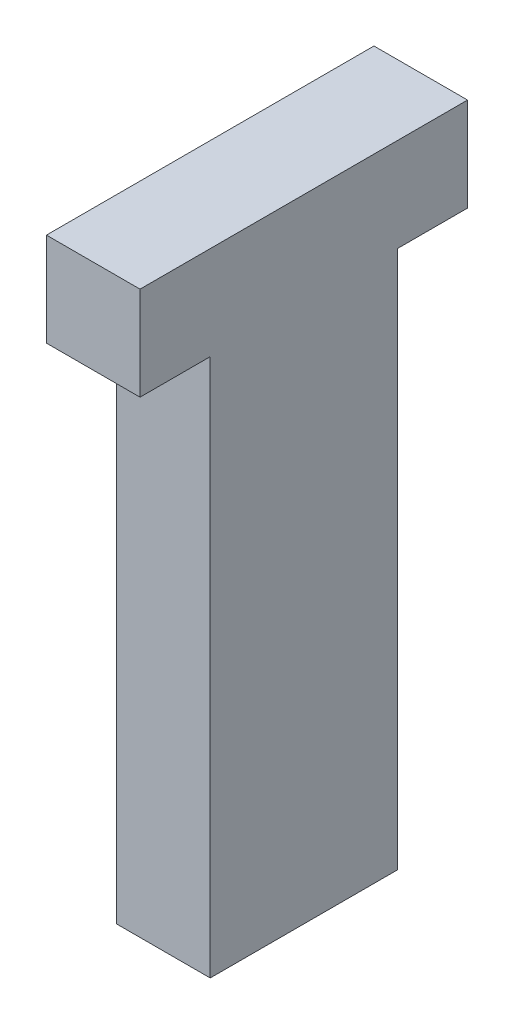
ISO-10303-21;
HEADER;
FILE_DESCRIPTION(('STEP AP214'),'2;1');
FILE_NAME('part.step','',(''),(''),'','','');
FILE_SCHEMA(('AUTOMOTIVE_DESIGN { 1 0 10303 214 1 1 1 1 }'));
ENDSEC;
DATA;
#1=APPLICATION_CONTEXT('core data for automotive mechanical design processes');
#2=APPLICATION_PROTOCOL_DEFINITION('international standard','automotive_design',2000,#1);
#3=PRODUCT_CONTEXT('',#1,'mechanical');
#4=PRODUCT('Part','Part','',(#3));
#5=PRODUCT_RELATED_PRODUCT_CATEGORY('part','',(#4));
#6=PRODUCT_DEFINITION_FORMATION('','',#4);
#7=PRODUCT_DEFINITION_CONTEXT('part definition',#1,'design');
#8=PRODUCT_DEFINITION('design','',#6,#7);
#9=PRODUCT_DEFINITION_SHAPE('','',#8);
#10=(LENGTH_UNIT() NAMED_UNIT(*) SI_UNIT(.MILLI.,.METRE.));
#11=(NAMED_UNIT(*) PLANE_ANGLE_UNIT() SI_UNIT($,.RADIAN.));
#12=(NAMED_UNIT(*) SI_UNIT($,.STERADIAN.) SOLID_ANGLE_UNIT());
#13=UNCERTAINTY_MEASURE_WITH_UNIT(LENGTH_MEASURE(1.E-05),#10,'distance_accuracy_value','');
#14=(GEOMETRIC_REPRESENTATION_CONTEXT(3) GLOBAL_UNCERTAINTY_ASSIGNED_CONTEXT((#13)) GLOBAL_UNIT_ASSIGNED_CONTEXT((#10,
#11,#12)) REPRESENTATION_CONTEXT('',''));
#15=CARTESIAN_POINT('',(0.,0.,0.));
#16=DIRECTION('',(0.,0.,1.));
#17=DIRECTION('',(1.,0.,0.));
#18=AXIS2_PLACEMENT_3D('',#15,#16,#17);
#19=CARTESIAN_POINT('',(0.,57.5,0.));
#20=DIRECTION('',(-1.,0.,0.));
#21=DIRECTION('',(0.,0.,1.));
#22=AXIS2_PLACEMENT_3D('',#19,#20,#21);
#23=PLANE('',#22);
#24=DIRECTION('',(0.,0.,-1.));
#25=VECTOR('',#24,1.);
#26=CARTESIAN_POINT('',(0.,0.,0.));
#27=LINE('',#26,#25);
#28=CARTESIAN_POINT('',(0.,0.,0.));
#29=VERTEX_POINT('',#28);
#30=CARTESIAN_POINT('',(0.,0.,-20.));
#31=VERTEX_POINT('',#30);
#32=EDGE_CURVE('E145',#29,#31,#27,.T.);
#33=ORIENTED_EDGE('',*,*,#32,.T.);
#34=DIRECTION('',(0.,-1.,0.));
#35=VECTOR('',#34,1.);
#36=CARTESIAN_POINT('',(0.,57.5,-20.));
#37=LINE('',#36,#35);
#38=CARTESIAN_POINT('',(0.,57.5,-20.));
#39=VERTEX_POINT('',#38);
#40=EDGE_CURVE('E11',#39,#31,#37,.T.);
#41=ORIENTED_EDGE('',*,*,#40,.F.);
#42=DIRECTION('',(0.,0.,-1.));
#43=VECTOR('',#42,1.);
#44=CARTESIAN_POINT('',(0.,57.5,-27.5));
#45=LINE('',#44,#43);
#46=CARTESIAN_POINT('',(0.,57.5,-27.5));
#47=VERTEX_POINT('',#46);
#48=EDGE_CURVE('E204',#39,#47,#45,.T.);
#49=ORIENTED_EDGE('',*,*,#48,.T.);
#50=DIRECTION('',(0.,-1.,0.));
#51=VECTOR('',#50,1.);
#52=CARTESIAN_POINT('',(0.,67.5,-27.5));
#53=LINE('',#52,#51);
#54=CARTESIAN_POINT('',(0.,67.5,-27.5));
#55=VERTEX_POINT('',#54);
#56=EDGE_CURVE('E152',#55,#47,#53,.T.);
#57=ORIENTED_EDGE('',*,*,#56,.F.);
#58=DIRECTION('',(0.,0.,-1.));
#59=VECTOR('',#58,1.);
#60=CARTESIAN_POINT('',(0.,67.5,0.));
#61=LINE('',#60,#59);
#62=CARTESIAN_POINT('',(0.,67.5,7.5));
#63=VERTEX_POINT('',#62);
#64=EDGE_CURVE('E128',#63,#55,#61,.T.);
#65=ORIENTED_EDGE('',*,*,#64,.F.);
#66=DIRECTION('',(0.,-1.,0.));
#67=VECTOR('',#66,1.);
#68=CARTESIAN_POINT('',(0.,67.5,7.5));
#69=LINE('',#68,#67);
#70=CARTESIAN_POINT('',(0.,57.5,7.5));
#71=VERTEX_POINT('',#70);
#72=EDGE_CURVE('E124',#63,#71,#69,.T.);
#73=ORIENTED_EDGE('',*,*,#72,.T.);
#74=CARTESIAN_POINT('',(0.,57.5,0.));
#75=VERTEX_POINT('',#74);
#76=EDGE_CURVE('E181',#71,#75,#45,.T.);
#77=ORIENTED_EDGE('',*,*,#76,.T.);
#78=DIRECTION('',(0.,-1.,0.));
#79=VECTOR('',#78,1.);
#80=CARTESIAN_POINT('',(0.,57.5,0.));
#81=LINE('',#80,#79);
#82=EDGE_CURVE('E161',#75,#29,#81,.T.);
#83=ORIENTED_EDGE('',*,*,#82,.T.);
#84=EDGE_LOOP('',(#33,#41,#49,#57,#65,#73,#77,#83));
#85=FACE_BOUND('',#84,.T.);
#86=ADVANCED_FACE('F45',(#85),#23,.F.);
#87=CARTESIAN_POINT('',(0.,57.5,-20.));
#88=DIRECTION('',(0.,0.,1.));
#89=DIRECTION('',(1.,0.,0.));
#90=AXIS2_PLACEMENT_3D('',#87,#88,#89);
#91=PLANE('',#90);
#92=DIRECTION('',(-1.,0.,0.));
#93=VECTOR('',#92,1.);
#94=CARTESIAN_POINT('',(0.,0.,-20.));
#95=LINE('',#94,#93);
#96=CARTESIAN_POINT('',(-10.,0.,-20.));
#97=VERTEX_POINT('',#96);
#98=EDGE_CURVE('E150',#31,#97,#95,.T.);
#99=ORIENTED_EDGE('',*,*,#98,.T.);
#100=DIRECTION('',(0.,-1.,0.));
#101=VECTOR('',#100,1.);
#102=CARTESIAN_POINT('',(-10.,57.5,-20.));
#103=LINE('',#102,#101);
#104=CARTESIAN_POINT('',(-10.,57.5,-20.));
#105=VERTEX_POINT('',#104);
#106=EDGE_CURVE('E54',#105,#97,#103,.T.);
#107=ORIENTED_EDGE('',*,*,#106,.F.);
#108=DIRECTION('',(-1.,0.,0.));
#109=VECTOR('',#108,1.);
#110=CARTESIAN_POINT('',(0.,57.5,-20.));
#111=LINE('',#110,#109);
#112=EDGE_CURVE('E88',#39,#105,#111,.T.);
#113=ORIENTED_EDGE('',*,*,#112,.F.);
#114=ORIENTED_EDGE('',*,*,#40,.T.);
#115=EDGE_LOOP('',(#99,#107,#113,#114));
#116=FACE_BOUND('',#115,.T.);
#117=ADVANCED_FACE('F226',(#116),#91,.F.);
#118=CARTESIAN_POINT('',(-10.,57.5,0.));
#119=DIRECTION('',(1.,0.,0.));
#120=DIRECTION('',(0.,0.,-1.));
#121=AXIS2_PLACEMENT_3D('',#118,#119,#120);
#122=PLANE('',#121);
#123=DIRECTION('',(0.,0.,1.));
#124=VECTOR('',#123,1.);
#125=CARTESIAN_POINT('',(-10.,0.,0.));
#126=LINE('',#125,#124);
#127=CARTESIAN_POINT('',(-10.,0.,0.));
#128=VERTEX_POINT('',#127);
#129=EDGE_CURVE('E78',#97,#128,#126,.T.);
#130=ORIENTED_EDGE('',*,*,#129,.T.);
#131=DIRECTION('',(0.,-1.,0.));
#132=VECTOR('',#131,1.);
#133=CARTESIAN_POINT('',(-10.,57.5,0.));
#134=LINE('',#133,#132);
#135=CARTESIAN_POINT('',(-10.,57.5,0.));
#136=VERTEX_POINT('',#135);
#137=EDGE_CURVE('E62',#136,#128,#134,.T.);
#138=ORIENTED_EDGE('',*,*,#137,.F.);
#139=DIRECTION('',(0.,0.,1.));
#140=VECTOR('',#139,1.);
#141=CARTESIAN_POINT('',(-10.,57.5,-10.));
#142=LINE('',#141,#140);
#143=CARTESIAN_POINT('',(-9.99999999999999,57.5,7.5));
#144=VERTEX_POINT('',#143);
#145=EDGE_CURVE('E142',#136,#144,#142,.T.);
#146=ORIENTED_EDGE('',*,*,#145,.T.);
#147=DIRECTION('',(0.,-1.,0.));
#148=VECTOR('',#147,1.);
#149=CARTESIAN_POINT('',(-9.99999999999999,67.5,7.5));
#150=LINE('',#149,#148);
#151=CARTESIAN_POINT('',(-9.99999999999999,67.5,7.5));
#152=VERTEX_POINT('',#151);
#153=EDGE_CURVE('E122',#152,#144,#150,.T.);
#154=ORIENTED_EDGE('',*,*,#153,.F.);
#155=DIRECTION('',(0.,0.,1.));
#156=VECTOR('',#155,1.);
#157=CARTESIAN_POINT('',(-9.99999999999999,67.5,7.5));
#158=LINE('',#157,#156);
#159=CARTESIAN_POINT('',(-10.,67.5,-27.5));
#160=VERTEX_POINT('',#159);
#161=EDGE_CURVE('E129',#160,#152,#158,.T.);
#162=ORIENTED_EDGE('',*,*,#161,.F.);
#163=DIRECTION('',(0.,-1.,0.));
#164=VECTOR('',#163,1.);
#165=CARTESIAN_POINT('',(-10.,67.5,-27.5));
#166=LINE('',#165,#164);
#167=CARTESIAN_POINT('',(-10.,57.5,-27.5));
#168=VERTEX_POINT('',#167);
#169=EDGE_CURVE('E194',#160,#168,#166,.T.);
#170=ORIENTED_EDGE('',*,*,#169,.T.);
#171=EDGE_CURVE('E138',#168,#105,#142,.T.);
#172=ORIENTED_EDGE('',*,*,#171,.T.);
#173=ORIENTED_EDGE('',*,*,#106,.T.);
#174=EDGE_LOOP('',(#130,#138,#146,#154,#162,#170,#172,#173));
#175=FACE_BOUND('',#174,.T.);
#176=ADVANCED_FACE('F140',(#175),#122,.F.);
#177=CARTESIAN_POINT('',(0.,57.5,0.));
#178=DIRECTION('',(0.,0.,-1.));
#179=DIRECTION('',(-1.,0.,0.));
#180=AXIS2_PLACEMENT_3D('',#177,#178,#179);
#181=PLANE('',#180);
#182=DIRECTION('',(1.,0.,0.));
#183=VECTOR('',#182,1.);
#184=CARTESIAN_POINT('',(0.,0.,0.));
#185=LINE('',#184,#183);
#186=EDGE_CURVE('E83',#128,#29,#185,.T.);
#187=ORIENTED_EDGE('',*,*,#186,.T.);
#188=ORIENTED_EDGE('',*,*,#82,.F.);
#189=DIRECTION('',(1.,0.,0.));
#190=VECTOR('',#189,1.);
#191=CARTESIAN_POINT('',(0.,57.5,0.));
#192=LINE('',#191,#190);
#193=EDGE_CURVE('E158',#136,#75,#192,.T.);
#194=ORIENTED_EDGE('',*,*,#193,.F.);
#195=ORIENTED_EDGE('',*,*,#137,.T.);
#196=EDGE_LOOP('',(#187,#188,#194,#195));
#197=FACE_BOUND('',#196,.T.);
#198=ADVANCED_FACE('F182',(#197),#181,.F.);
#199=CARTESIAN_POINT('',(0.,0.,0.));
#200=DIRECTION('',(0.,1.,0.));
#201=DIRECTION('',(0.,0.,1.));
#202=AXIS2_PLACEMENT_3D('',#199,#200,#201);
#203=PLANE('',#202);
#204=ORIENTED_EDGE('',*,*,#32,.F.);
#205=ORIENTED_EDGE('',*,*,#186,.F.);
#206=ORIENTED_EDGE('',*,*,#129,.F.);
#207=ORIENTED_EDGE('',*,*,#98,.F.);
#208=EDGE_LOOP('',(#204,#205,#206,#207));
#209=FACE_BOUND('',#208,.T.);
#210=ADVANCED_FACE('F177',(#209),#203,.F.);
#211=CARTESIAN_POINT('',(0.,57.5,0.));
#212=DIRECTION('',(0.,-1.,0.));
#213=DIRECTION('',(0.,0.,-1.));
#214=AXIS2_PLACEMENT_3D('',#211,#212,#213);
#215=PLANE('',#214);
#216=ORIENTED_EDGE('',*,*,#48,.F.);
#217=ORIENTED_EDGE('',*,*,#112,.T.);
#218=ORIENTED_EDGE('',*,*,#171,.F.);
#219=DIRECTION('',(-1.,0.,0.));
#220=VECTOR('',#219,1.);
#221=CARTESIAN_POINT('',(-10.,57.5,-27.5));
#222=LINE('',#221,#220);
#223=EDGE_CURVE('E187',#47,#168,#222,.T.);
#224=ORIENTED_EDGE('',*,*,#223,.F.);
#225=EDGE_LOOP('',(#216,#217,#218,#224));
#226=FACE_BOUND('',#225,.T.);
#227=ADVANCED_FACE('F203',(#226),#215,.T.);
#228=CARTESIAN_POINT('',(0.,67.5,7.5));
#229=DIRECTION('',(0.,0.,-1.));
#230=DIRECTION('',(-1.,0.,0.));
#231=AXIS2_PLACEMENT_3D('',#228,#229,#230);
#232=PLANE('',#231);
#233=DIRECTION('',(1.,0.,0.));
#234=VECTOR('',#233,1.);
#235=CARTESIAN_POINT('',(0.,57.5,7.5));
#236=LINE('',#235,#234);
#237=EDGE_CURVE('E185',#144,#71,#236,.T.);
#238=ORIENTED_EDGE('',*,*,#237,.T.);
#239=ORIENTED_EDGE('',*,*,#72,.F.);
#240=DIRECTION('',(1.,0.,0.));
#241=VECTOR('',#240,1.);
#242=CARTESIAN_POINT('',(0.,67.5,7.5));
#243=LINE('',#242,#241);
#244=EDGE_CURVE('E117',#152,#63,#243,.T.);
#245=ORIENTED_EDGE('',*,*,#244,.F.);
#246=ORIENTED_EDGE('',*,*,#153,.T.);
#247=EDGE_LOOP('',(#238,#239,#245,#246));
#248=FACE_BOUND('',#247,.T.);
#249=ADVANCED_FACE('F120',(#248),#232,.F.);
#250=CARTESIAN_POINT('',(-10.,67.5,-27.5));
#251=DIRECTION('',(0.,0.,1.));
#252=DIRECTION('',(1.,0.,0.));
#253=AXIS2_PLACEMENT_3D('',#250,#251,#252);
#254=PLANE('',#253);
#255=ORIENTED_EDGE('',*,*,#223,.T.);
#256=ORIENTED_EDGE('',*,*,#169,.F.);
#257=DIRECTION('',(-1.,0.,0.));
#258=VECTOR('',#257,1.);
#259=CARTESIAN_POINT('',(-10.,67.5,-27.5));
#260=LINE('',#259,#258);
#261=EDGE_CURVE('E134',#55,#160,#260,.T.);
#262=ORIENTED_EDGE('',*,*,#261,.F.);
#263=ORIENTED_EDGE('',*,*,#56,.T.);
#264=EDGE_LOOP('',(#255,#256,#262,#263));
#265=FACE_BOUND('',#264,.T.);
#266=ADVANCED_FACE('F201',(#265),#254,.F.);
#267=CARTESIAN_POINT('',(0.,67.5,0.));
#268=DIRECTION('',(0.,-1.,0.));
#269=DIRECTION('',(0.,0.,-1.));
#270=AXIS2_PLACEMENT_3D('',#267,#268,#269);
#271=PLANE('',#270);
#272=ORIENTED_EDGE('',*,*,#161,.T.);
#273=ORIENTED_EDGE('',*,*,#244,.T.);
#274=ORIENTED_EDGE('',*,*,#64,.T.);
#275=ORIENTED_EDGE('',*,*,#261,.T.);
#276=EDGE_LOOP('',(#272,#273,#274,#275));
#277=FACE_BOUND('',#276,.T.);
#278=ADVANCED_FACE('F132',(#277),#271,.F.);
#279=ORIENTED_EDGE('',*,*,#145,.F.);
#280=ORIENTED_EDGE('',*,*,#193,.T.);
#281=ORIENTED_EDGE('',*,*,#76,.F.);
#282=ORIENTED_EDGE('',*,*,#237,.F.);
#283=EDGE_LOOP('',(#279,#280,#281,#282));
#284=FACE_BOUND('',#283,.T.);
#285=ADVANCED_FACE('F184',(#284),#215,.T.);
#286=CLOSED_SHELL('',(#86,#117,#176,#198,#210,#227,#249,#266,#278,#285));
#287=MANIFOLD_SOLID_BREP('B2',#286);
#288=ADVANCED_BREP_SHAPE_REPRESENTATION('',(#18,#287),#14);
#289=SHAPE_DEFINITION_REPRESENTATION(#9,#288);
ENDSEC;
END-ISO-10303-21;
